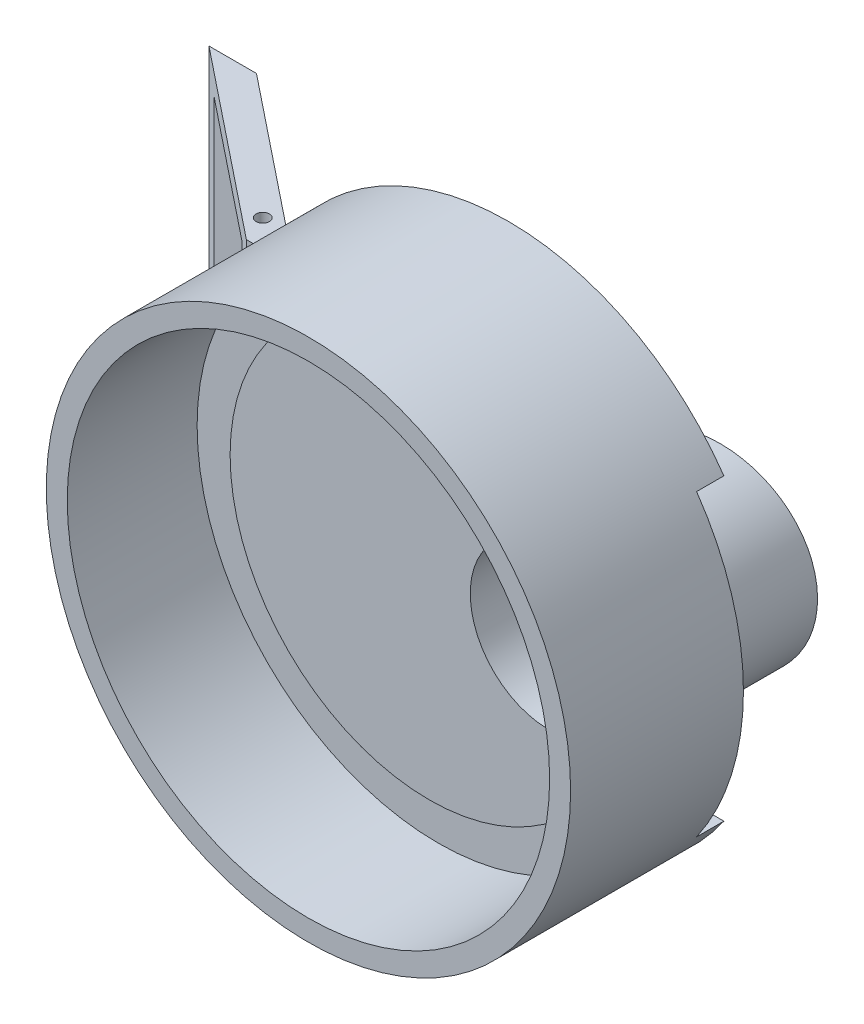
ISO-10303-21;
HEADER;
FILE_DESCRIPTION(('STEP AP214'),'2;1');
FILE_NAME('part.step','',(''),(''),'','','');
FILE_SCHEMA(('AUTOMOTIVE_DESIGN { 1 0 10303 214 1 1 1 1 }'));
ENDSEC;
DATA;
#1=APPLICATION_CONTEXT('core data for automotive mechanical design processes');
#2=APPLICATION_PROTOCOL_DEFINITION('international standard','automotive_design',2000,#1);
#3=PRODUCT_CONTEXT('',#1,'mechanical');
#4=PRODUCT('Part','Part','',(#3));
#5=PRODUCT_RELATED_PRODUCT_CATEGORY('part','',(#4));
#6=PRODUCT_DEFINITION_FORMATION('','',#4);
#7=PRODUCT_DEFINITION_CONTEXT('part definition',#1,'design');
#8=PRODUCT_DEFINITION('design','',#6,#7);
#9=PRODUCT_DEFINITION_SHAPE('','',#8);
#10=(LENGTH_UNIT() NAMED_UNIT(*) SI_UNIT(.MILLI.,.METRE.));
#11=(NAMED_UNIT(*) PLANE_ANGLE_UNIT() SI_UNIT($,.RADIAN.));
#12=(NAMED_UNIT(*) SI_UNIT($,.STERADIAN.) SOLID_ANGLE_UNIT());
#13=UNCERTAINTY_MEASURE_WITH_UNIT(LENGTH_MEASURE(1.E-05),#10,'distance_accuracy_value','');
#14=(GEOMETRIC_REPRESENTATION_CONTEXT(3) GLOBAL_UNCERTAINTY_ASSIGNED_CONTEXT((#13)) GLOBAL_UNIT_ASSIGNED_CONTEXT((#10,
#11,#12)) REPRESENTATION_CONTEXT('',''));
#15=CARTESIAN_POINT('',(0.,0.,0.));
#16=DIRECTION('',(0.,0.,1.));
#17=DIRECTION('',(1.,0.,0.));
#18=AXIS2_PLACEMENT_3D('',#15,#16,#17);
#19=CARTESIAN_POINT('',(0.,0.,-50.1023826602094));
#20=DIRECTION('',(0.,0.,-1.));
#21=DIRECTION('',(-1.,0.,0.));
#22=AXIS2_PLACEMENT_3D('',#19,#20,#21);
#23=PLANE('',#22);
#24=DIRECTION('',(1.,0.,0.));
#25=VECTOR('',#24,1.);
#26=CARTESIAN_POINT('',(0.,18.1080161915398,-50.1023826602094));
#27=LINE('',#26,#25);
#28=CARTESIAN_POINT('',(-26.0799204294594,18.1080161915398,-50.1023826602094));
#29=VERTEX_POINT('',#28);
#30=CARTESIAN_POINT('',(26.0799204294594,18.1080161915398,-50.1023826602094));
#31=VERTEX_POINT('',#30);
#32=EDGE_CURVE('E172',#29,#31,#27,.T.);
#33=ORIENTED_EDGE('',*,*,#32,.F.);
#34=CARTESIAN_POINT('',(0.,0.,-50.1023826602094));
#35=DIRECTION('',(0.,0.,1.));
#36=DIRECTION('',(1.,0.,0.));
#37=AXIS2_PLACEMENT_3D('',#34,#35,#36);
#38=CIRCLE('',#37,31.75);
#39=EDGE_CURVE('E58',#31,#29,#38,.T.);
#40=ORIENTED_EDGE('',*,*,#39,.F.);
#41=EDGE_LOOP('',(#33,#40));
#42=FACE_BOUND('',#41,.T.);
#43=ADVANCED_FACE('F47',(#42),#23,.T.);
#44=CARTESIAN_POINT('',(-26.0799204294594,-18.1080161915398,-50.1023826602094));
#45=VERTEX_POINT('',#44);
#46=CARTESIAN_POINT('',(26.0799204294594,-18.1080161915398,-50.1023826602094));
#47=VERTEX_POINT('',#46);
#48=EDGE_CURVE('E488',#45,#47,#38,.T.);
#49=ORIENTED_EDGE('',*,*,#48,.F.);
#50=DIRECTION('',(1.,0.,0.));
#51=VECTOR('',#50,1.);
#52=CARTESIAN_POINT('',(0.,-18.1080161915398,-50.1023826602094));
#53=LINE('',#52,#51);
#54=EDGE_CURVE('E215',#45,#47,#53,.T.);
#55=ORIENTED_EDGE('',*,*,#54,.T.);
#56=EDGE_LOOP('',(#49,#55));
#57=FACE_BOUND('',#56,.T.);
#58=ADVANCED_FACE('F376',(#57),#23,.T.);
#59=CARTESIAN_POINT('',(-25.9963160724515,13.97,-50.1023826602094));
#60=DIRECTION('',(-0.624333953493612,0.,0.781157547819284));
#61=DIRECTION('',(0.781157547819284,0.,0.624333953493612));
#62=AXIS2_PLACEMENT_3D('',#59,#60,#61);
#63=PLANE('',#62);
#64=DIRECTION('',(-0.781157547819284,0.,-0.624333953493612));
#65=VECTOR('',#64,1.);
#66=CARTESIAN_POINT('',(-25.9963160724515,-13.97,-50.1023826602094));
#67=LINE('',#66,#65);
#68=CARTESIAN_POINT('',(-25.9963160724515,-13.97,-50.1023826602094));
#69=VERTEX_POINT('',#68);
#70=CARTESIAN_POINT('',(-48.5659105228202,-13.97,-68.1409514115236));
#71=VERTEX_POINT('',#70);
#72=EDGE_CURVE('E455',#69,#71,#67,.T.);
#73=ORIENTED_EDGE('',*,*,#72,.T.);
#74=DIRECTION('',(0.,-1.,0.));
#75=VECTOR('',#74,1.);
#76=CARTESIAN_POINT('',(-48.5659105228202,13.97,-68.1409514115236));
#77=LINE('',#76,#75);
#78=CARTESIAN_POINT('',(-48.5659105228202,13.97,-68.1409514115236));
#79=VERTEX_POINT('',#78);
#80=EDGE_CURVE('E464',#79,#71,#77,.T.);
#81=ORIENTED_EDGE('',*,*,#80,.F.);
#82=DIRECTION('',(-0.781157547819284,0.,-0.624333953493612));
#83=VECTOR('',#82,1.);
#84=CARTESIAN_POINT('',(-25.9963160724515,13.97,-50.1023826602094));
#85=LINE('',#84,#83);
#86=CARTESIAN_POINT('',(-25.9963160724515,13.97,-50.1023826602094));
#87=VERTEX_POINT('',#86);
#88=EDGE_CURVE('E445',#87,#79,#85,.T.);
#89=ORIENTED_EDGE('',*,*,#88,.F.);
#90=DIRECTION('',(0.,-1.,0.));
#91=VECTOR('',#90,1.);
#92=CARTESIAN_POINT('',(-25.9963160724515,13.97,-50.1023826602094));
#93=LINE('',#92,#91);
#94=EDGE_CURVE('E467',#87,#69,#93,.T.);
#95=ORIENTED_EDGE('',*,*,#94,.T.);
#96=EDGE_LOOP('',(#73,#81,#89,#95));
#97=FACE_BOUND('',#96,.T.);
#98=DIRECTION('',(0.,1.,0.));
#99=VECTOR('',#98,1.);
#100=CARTESIAN_POINT('',(-45.5897002656287,10.795,-65.762239048713));
#101=LINE('',#100,#99);
#102=CARTESIAN_POINT('',(-45.5897002656287,-10.795,-65.762239048713));
#103=VERTEX_POINT('',#102);
#104=CARTESIAN_POINT('',(-45.5897002656287,10.795,-65.762239048713));
#105=VERTEX_POINT('',#104);
#106=EDGE_CURVE('E256',#103,#105,#101,.T.);
#107=ORIENTED_EDGE('',*,*,#106,.F.);
#108=DIRECTION('',(-0.781157547819283,0.,-0.624333953493612));
#109=VECTOR('',#108,1.);
#110=CARTESIAN_POINT('',(-28.7245088082104,-10.795,-52.2828689927859));
#111=LINE('',#110,#109);
#112=CARTESIAN_POINT('',(-28.7245088082104,-10.795,-52.2828689927859));
#113=VERTEX_POINT('',#112);
#114=EDGE_CURVE('E404',#113,#103,#111,.T.);
#115=ORIENTED_EDGE('',*,*,#114,.F.);
#116=DIRECTION('',(0.,-1.,0.));
#117=VECTOR('',#116,1.);
#118=CARTESIAN_POINT('',(-28.7245088082104,10.795,-52.2828689927859));
#119=LINE('',#118,#117);
#120=CARTESIAN_POINT('',(-28.7245088082104,10.795,-52.2828689927859));
#121=VERTEX_POINT('',#120);
#122=EDGE_CURVE('E227',#121,#113,#119,.T.);
#123=ORIENTED_EDGE('',*,*,#122,.F.);
#124=DIRECTION('',(0.781157547819283,0.,0.624333953493612));
#125=VECTOR('',#124,1.);
#126=CARTESIAN_POINT('',(-28.7245088082104,10.795,-52.2828689927859));
#127=LINE('',#126,#125);
#128=EDGE_CURVE('E409',#105,#121,#127,.T.);
#129=ORIENTED_EDGE('',*,*,#128,.F.);
#130=EDGE_LOOP('',(#107,#115,#123,#129));
#131=FACE_BOUND('',#130,.T.);
#132=ADVANCED_FACE('F349',(#97,#131),#63,.F.);
#133=CARTESIAN_POINT('',(-31.75,13.97,-50.1023826602094));
#134=DIRECTION('',(0.624333953493612,0.,-0.781157547819284));
#135=DIRECTION('',(-0.781157547819284,0.,-0.624333953493612));
#136=AXIS2_PLACEMENT_3D('',#133,#134,#135);
#137=PLANE('',#136);
#138=DIRECTION('',(0.781157547819284,0.,0.624333953493612));
#139=VECTOR('',#138,1.);
#140=CARTESIAN_POINT('',(-31.75,-13.97,-50.1023826602094));
#141=LINE('',#140,#139);
#142=CARTESIAN_POINT('',(-54.3195944503687,-13.97,-68.1409514115236));
#143=VERTEX_POINT('',#142);
#144=CARTESIAN_POINT('',(-31.75,-13.97,-50.1023826602094));
#145=VERTEX_POINT('',#144);
#146=EDGE_CURVE('E446',#143,#145,#141,.T.);
#147=ORIENTED_EDGE('',*,*,#146,.T.);
#148=DIRECTION('',(0.,-1.,0.));
#149=VECTOR('',#148,1.);
#150=CARTESIAN_POINT('',(-31.75,13.97,-50.1023826602094));
#151=LINE('',#150,#149);
#152=CARTESIAN_POINT('',(-31.75,0.,-50.1023826602094));
#153=VERTEX_POINT('',#152);
#154=EDGE_CURVE('E462',#153,#145,#151,.T.);
#155=ORIENTED_EDGE('',*,*,#154,.F.);
#156=CARTESIAN_POINT('',(-31.75,13.97,-50.1023826602094));
#157=VERTEX_POINT('',#156);
#158=EDGE_CURVE('E459',#157,#153,#151,.T.);
#159=ORIENTED_EDGE('',*,*,#158,.F.);
#160=DIRECTION('',(0.781157547819285,0.,0.62433395349361));
#161=VECTOR('',#160,1.);
#162=CARTESIAN_POINT('',(-52.8910135269167,13.97,-66.9991694773745));
#163=LINE('',#162,#161);
#164=CARTESIAN_POINT('',(-54.3195944503687,13.97,-68.1409514115236));
#165=VERTEX_POINT('',#164);
#166=EDGE_CURVE('E441',#165,#157,#163,.T.);
#167=ORIENTED_EDGE('',*,*,#166,.F.);
#168=DIRECTION('',(0.,-1.,0.));
#169=VECTOR('',#168,1.);
#170=CARTESIAN_POINT('',(-54.3195944503687,13.97,-68.1409514115236));
#171=LINE('',#170,#169);
#172=EDGE_CURVE('E461',#165,#143,#171,.T.);
#173=ORIENTED_EDGE('',*,*,#172,.T.);
#174=EDGE_LOOP('',(#147,#155,#159,#167,#173));
#175=FACE_BOUND('',#174,.T.);
#176=DIRECTION('',(0.,-1.,0.));
#177=VECTOR('',#176,1.);
#178=CARTESIAN_POINT('',(-51.3433841931772,11.43,-65.762239048713));
#179=LINE('',#178,#177);
#180=CARTESIAN_POINT('',(-51.3433841931772,11.43,-65.762239048713));
#181=VERTEX_POINT('',#180);
#182=CARTESIAN_POINT('',(-51.3433841931772,-10.16,-65.762239048713));
#183=VERTEX_POINT('',#182);
#184=EDGE_CURVE('E249',#181,#183,#179,.T.);
#185=ORIENTED_EDGE('',*,*,#184,.F.);
#186=DIRECTION('',(-0.781157547819284,0.,-0.624333953493612));
#187=VECTOR('',#186,1.);
#188=CARTESIAN_POINT('',(-51.3433841931772,11.43,-65.762239048713));
#189=LINE('',#188,#187);
#190=CARTESIAN_POINT('',(-34.4781927357589,11.43,-52.2828689927859));
#191=VERTEX_POINT('',#190);
#192=EDGE_CURVE('E332',#191,#181,#189,.T.);
#193=ORIENTED_EDGE('',*,*,#192,.F.);
#194=DIRECTION('',(0.,1.,0.));
#195=VECTOR('',#194,1.);
#196=CARTESIAN_POINT('',(-34.4781927357589,11.43,-52.2828689927859));
#197=LINE('',#196,#195);
#198=CARTESIAN_POINT('',(-34.4781927357589,-10.16,-52.2828689927859));
#199=VERTEX_POINT('',#198);
#200=EDGE_CURVE('E292',#199,#191,#197,.T.);
#201=ORIENTED_EDGE('',*,*,#200,.F.);
#202=DIRECTION('',(0.781157547819284,0.,0.624333953493612));
#203=VECTOR('',#202,1.);
#204=CARTESIAN_POINT('',(-51.3433841931772,-10.16,-65.762239048713));
#205=LINE('',#204,#203);
#206=EDGE_CURVE('E73',#183,#199,#205,.T.);
#207=ORIENTED_EDGE('',*,*,#206,.F.);
#208=EDGE_LOOP('',(#185,#193,#201,#207));
#209=FACE_BOUND('',#208,.T.);
#210=ADVANCED_FACE('F331',(#175,#209),#137,.F.);
#211=DIRECTION('',(-1.,0.,0.));
#212=VECTOR('',#211,1.);
#213=CARTESIAN_POINT('',(0.,13.9699999999999,-50.1023826602094));
#214=LINE('',#213,#212);
#215=CARTESIAN_POINT('',(-5.01861852067778,13.9699999999999,-50.1023826602094));
#216=VERTEX_POINT('',#215);
#217=EDGE_CURVE('E191',#216,#87,#214,.T.);
#218=ORIENTED_EDGE('',*,*,#217,.F.);
#219=DIRECTION('',(0.,-1.,0.));
#220=VECTOR('',#219,1.);
#221=CARTESIAN_POINT('',(-5.01861852067778,0.,-50.1023826602094));
#222=LINE('',#221,#220);
#223=CARTESIAN_POINT('',(-5.01861852067778,-13.97,-50.1023826602094));
#224=VERTEX_POINT('',#223);
#225=EDGE_CURVE('E221',#216,#224,#222,.T.);
#226=ORIENTED_EDGE('',*,*,#225,.T.);
#227=DIRECTION('',(1.,0.,0.));
#228=VECTOR('',#227,1.);
#229=CARTESIAN_POINT('',(0.,-13.97,-50.1023826602094));
#230=LINE('',#229,#228);
#231=EDGE_CURVE('E219',#69,#224,#230,.T.);
#232=ORIENTED_EDGE('',*,*,#231,.F.);
#233=ORIENTED_EDGE('',*,*,#94,.F.);
#234=EDGE_LOOP('',(#218,#226,#232,#233));
#235=FACE_BOUND('',#234,.T.);
#236=ADVANCED_FACE('F49',(#235),#23,.T.);
#237=CARTESIAN_POINT('',(0.,0.,0.));
#238=DIRECTION('',(0.,0.,1.));
#239=DIRECTION('',(1.,0.,0.));
#240=AXIS2_PLACEMENT_3D('',#237,#238,#239);
#241=CYLINDRICAL_SURFACE('',#240,31.75);
#242=DIRECTION('',(0.,0.,-1.));
#243=VECTOR('',#242,1.);
#244=CARTESIAN_POINT('',(-28.5114292872174,-13.97,-46.8003826602094));
#245=LINE('',#244,#243);
#246=CARTESIAN_POINT('',(-28.5114292872174,-13.97,-46.8003826602094));
#247=VERTEX_POINT('',#246);
#248=CARTESIAN_POINT('',(-28.5114292872174,-13.97,-50.1023826602094));
#249=VERTEX_POINT('',#248);
#250=EDGE_CURVE('E235',#247,#249,#245,.T.);
#251=ORIENTED_EDGE('',*,*,#250,.F.);
#252=CARTESIAN_POINT('',(0.,0.,-46.8003826602094));
#253=DIRECTION('',(0.,0.,-1.));
#254=DIRECTION('',(-1.,0.,0.));
#255=AXIS2_PLACEMENT_3D('',#252,#253,#254);
#256=CIRCLE('',#255,31.75);
#257=CARTESIAN_POINT('',(-26.0799204294594,-18.1080161915398,-46.8003826602094));
#258=VERTEX_POINT('',#257);
#259=EDGE_CURVE('E199',#258,#247,#256,.T.);
#260=ORIENTED_EDGE('',*,*,#259,.F.);
#261=DIRECTION('',(0.,0.,-1.));
#262=VECTOR('',#261,1.);
#263=CARTESIAN_POINT('',(-26.0799204294594,-18.1080161915398,-46.8003826602094));
#264=LINE('',#263,#262);
#265=EDGE_CURVE('E237',#258,#45,#264,.T.);
#266=ORIENTED_EDGE('',*,*,#265,.T.);
#267=ORIENTED_EDGE('',*,*,#48,.T.);
#268=DIRECTION('',(0.,0.,-1.));
#269=VECTOR('',#268,1.);
#270=CARTESIAN_POINT('',(26.0799204294594,-18.1080161915398,-46.8003826602094));
#271=LINE('',#270,#269);
#272=CARTESIAN_POINT('',(26.0799204294594,-18.1080161915398,-46.8003826602094));
#273=VERTEX_POINT('',#272);
#274=EDGE_CURVE('E177',#273,#47,#271,.T.);
#275=ORIENTED_EDGE('',*,*,#274,.F.);
#276=CARTESIAN_POINT('',(26.0799204294594,18.1080161915398,-46.8003826602094));
#277=VERTEX_POINT('',#276);
#278=EDGE_CURVE('E185',#277,#273,#256,.T.);
#279=ORIENTED_EDGE('',*,*,#278,.F.);
#280=DIRECTION('',(0.,0.,-1.));
#281=VECTOR('',#280,1.);
#282=CARTESIAN_POINT('',(26.0799204294594,18.1080161915398,-46.8003826602094));
#283=LINE('',#282,#281);
#284=EDGE_CURVE('E166',#277,#31,#283,.T.);
#285=ORIENTED_EDGE('',*,*,#284,.T.);
#286=ORIENTED_EDGE('',*,*,#39,.T.);
#287=DIRECTION('',(0.,0.,-1.));
#288=VECTOR('',#287,1.);
#289=CARTESIAN_POINT('',(-26.0799204294594,18.1080161915398,-46.8003826602094));
#290=LINE('',#289,#288);
#291=CARTESIAN_POINT('',(-26.0799204294594,18.1080161915398,-46.8003826602094));
#292=VERTEX_POINT('',#291);
#293=EDGE_CURVE('E225',#292,#29,#290,.T.);
#294=ORIENTED_EDGE('',*,*,#293,.F.);
#295=CARTESIAN_POINT('',(-28.5114292872174,13.97,-46.8003826602094));
#296=VERTEX_POINT('',#295);
#297=EDGE_CURVE('E189',#296,#292,#256,.T.);
#298=ORIENTED_EDGE('',*,*,#297,.F.);
#299=DIRECTION('',(0.,0.,-1.));
#300=VECTOR('',#299,1.);
#301=CARTESIAN_POINT('',(-28.5114292872174,13.97,-46.8003826602094));
#302=LINE('',#301,#300);
#303=CARTESIAN_POINT('',(-28.5114292872174,13.97,-50.1023826602094));
#304=VERTEX_POINT('',#303);
#305=EDGE_CURVE('E228',#296,#304,#302,.T.);
#306=ORIENTED_EDGE('',*,*,#305,.T.);
#307=EDGE_CURVE('E12',#304,#153,#38,.T.);
#308=ORIENTED_EDGE('',*,*,#307,.T.);
#309=EDGE_CURVE('E56',#153,#249,#38,.T.);
#310=ORIENTED_EDGE('',*,*,#309,.T.);
#311=EDGE_LOOP('',(#251,#260,#266,#267,#275,#279,#285,#286,#294,#298,#306,#308,#310));
#312=FACE_BOUND('',#311,.T.);
#313=CARTESIAN_POINT('',(0.,0.,-25.8707826602094));
#314=DIRECTION('',(0.,0.,1.));
#315=DIRECTION('',(1.,0.,0.));
#316=AXIS2_PLACEMENT_3D('',#313,#314,#315);
#317=CIRCLE('',#316,31.75);
#318=CARTESIAN_POINT('',(31.75,0.,-25.8707826602094));
#319=VERTEX_POINT('',#318);
#320=EDGE_CURVE('E484',#319,#319,#317,.T.);
#321=ORIENTED_EDGE('',*,*,#320,.F.);
#322=EDGE_LOOP('',(#321));
#323=FACE_BOUND('',#322,.T.);
#324=ADVANCED_FACE('F194',(#312,#323),#241,.T.);
#325=CARTESIAN_POINT('',(31.75,0.,-25.8707826602094));
#326=DIRECTION('',(0.,0.,1.));
#327=DIRECTION('',(1.,0.,0.));
#328=AXIS2_PLACEMENT_3D('',#325,#326,#327);
#329=PLANE('',#328);
#330=ORIENTED_EDGE('',*,*,#320,.T.);
#331=EDGE_LOOP('',(#330));
#332=FACE_BOUND('',#331,.T.);
#333=CARTESIAN_POINT('',(0.,0.,-25.8707826602094));
#334=DIRECTION('',(0.,0.,1.));
#335=DIRECTION('',(1.,0.,0.));
#336=AXIS2_PLACEMENT_3D('',#333,#334,#335);
#337=CIRCLE('',#336,29.21);
#338=CARTESIAN_POINT('',(29.21,0.,-25.8707826602094));
#339=VERTEX_POINT('',#338);
#340=EDGE_CURVE('E482',#339,#339,#337,.T.);
#341=ORIENTED_EDGE('',*,*,#340,.F.);
#342=EDGE_LOOP('',(#341));
#343=FACE_BOUND('',#342,.T.);
#344=ADVANCED_FACE('F523',(#332,#343),#329,.T.);
#345=CARTESIAN_POINT('',(0.,0.,0.));
#346=DIRECTION('',(0.,0.,1.));
#347=DIRECTION('',(1.,0.,0.));
#348=AXIS2_PLACEMENT_3D('',#345,#346,#347);
#349=CYLINDRICAL_SURFACE('',#348,29.21);
#350=ORIENTED_EDGE('',*,*,#340,.T.);
#351=EDGE_LOOP('',(#350));
#352=FACE_BOUND('',#351,.T.);
#353=CARTESIAN_POINT('',(0.,0.,-41.5978991912802));
#354=DIRECTION('',(0.,0.,1.));
#355=DIRECTION('',(1.,0.,0.));
#356=AXIS2_PLACEMENT_3D('',#353,#354,#355);
#357=CIRCLE('',#356,29.21);
#358=CARTESIAN_POINT('',(29.21,0.,-41.5978991912802));
#359=VERTEX_POINT('',#358);
#360=EDGE_CURVE('E479',#359,#359,#357,.T.);
#361=ORIENTED_EDGE('',*,*,#360,.F.);
#362=EDGE_LOOP('',(#361));
#363=FACE_BOUND('',#362,.T.);
#364=ADVANCED_FACE('F737',(#352,#363),#349,.F.);
#365=CARTESIAN_POINT('',(29.21,0.,-41.5978991912802));
#366=DIRECTION('',(0.,0.,1.));
#367=DIRECTION('',(1.,0.,0.));
#368=AXIS2_PLACEMENT_3D('',#365,#366,#367);
#369=PLANE('',#368);
#370=ORIENTED_EDGE('',*,*,#360,.T.);
#371=EDGE_LOOP('',(#370));
#372=FACE_BOUND('',#371,.T.);
#373=CARTESIAN_POINT('',(0.,0.,-41.5978991912802));
#374=DIRECTION('',(0.,0.,1.));
#375=DIRECTION('',(1.,0.,0.));
#376=AXIS2_PLACEMENT_3D('',#373,#374,#375);
#377=CIRCLE('',#376,24.13);
#378=CARTESIAN_POINT('',(24.13,0.,-41.5978991912802));
#379=VERTEX_POINT('',#378);
#380=EDGE_CURVE('E476',#379,#379,#377,.T.);
#381=ORIENTED_EDGE('',*,*,#380,.F.);
#382=EDGE_LOOP('',(#381));
#383=FACE_BOUND('',#382,.T.);
#384=ADVANCED_FACE('F727',(#372,#383),#369,.T.);
#385=CARTESIAN_POINT('',(0.,0.,0.));
#386=DIRECTION('',(0.,0.,1.));
#387=DIRECTION('',(1.,0.,0.));
#388=AXIS2_PLACEMENT_3D('',#385,#386,#387);
#389=CYLINDRICAL_SURFACE('',#388,24.13);
#390=ORIENTED_EDGE('',*,*,#380,.T.);
#391=EDGE_LOOP('',(#390));
#392=FACE_BOUND('',#391,.T.);
#393=CARTESIAN_POINT('',(0.,0.,-40.5138826602094));
#394=DIRECTION('',(0.,0.,1.));
#395=DIRECTION('',(1.,0.,0.));
#396=AXIS2_PLACEMENT_3D('',#393,#394,#395);
#397=CIRCLE('',#396,24.13);
#398=CARTESIAN_POINT('',(24.13,0.,-40.5138826602094));
#399=VERTEX_POINT('',#398);
#400=EDGE_CURVE('E473',#399,#399,#397,.T.);
#401=ORIENTED_EDGE('',*,*,#400,.F.);
#402=EDGE_LOOP('',(#401));
#403=FACE_BOUND('',#402,.T.);
#404=ADVANCED_FACE('F717',(#392,#403),#389,.T.);
#405=CARTESIAN_POINT('',(24.13,0.,-40.5138826602094));
#406=DIRECTION('',(0.,0.,1.));
#407=DIRECTION('',(1.,0.,0.));
#408=AXIS2_PLACEMENT_3D('',#405,#406,#407);
#409=PLANE('',#408);
#410=CARTESIAN_POINT('',(14.478,0.,-40.5138826602094));
#411=DIRECTION('',(0.,0.,1.));
#412=DIRECTION('',(1.,0.,0.));
#413=AXIS2_PLACEMENT_3D('',#410,#411,#412);
#414=CIRCLE('',#413,9.52500000000001);
#415=CARTESIAN_POINT('',(24.003,0.,-40.5138826602094));
#416=VERTEX_POINT('',#415);
#417=EDGE_CURVE('E470',#416,#416,#414,.T.);
#418=ORIENTED_EDGE('',*,*,#417,.F.);
#419=EDGE_LOOP('',(#418));
#420=FACE_BOUND('',#419,.T.);
#421=ORIENTED_EDGE('',*,*,#400,.T.);
#422=EDGE_LOOP('',(#421));
#423=FACE_BOUND('',#422,.T.);
#424=ADVANCED_FACE('F616',(#420,#423),#409,.T.);
#425=CARTESIAN_POINT('',(14.478,0.,-91.3138826602094));
#426=DIRECTION('',(0.,0.,1.));
#427=DIRECTION('',(1.,0.,0.));
#428=AXIS2_PLACEMENT_3D('',#425,#426,#427);
#429=CYLINDRICAL_SURFACE('',#428,9.52500000000001);
#430=CARTESIAN_POINT('',(14.478,0.,-59.1708696006639));
#431=DIRECTION('',(0.148509647000191,0.,0.988910958958327));
#432=DIRECTION('',(-0.988910958958327,0.,0.148509647000191));
#433=AXIS2_PLACEMENT_3D('',#430,#431,#432);
#434=ELLIPSE('',#433,9.63180750877025,9.52500000000001);
#435=CARTESIAN_POINT('',(4.95299999999999,0.,-57.7404532675627));
#436=VERTEX_POINT('',#435);
#437=EDGE_CURVE('E216',#436,#436,#434,.F.);
#438=ORIENTED_EDGE('',*,*,#437,.T.);
#439=EDGE_LOOP('',(#438));
#440=FACE_BOUND('',#439,.T.);
#441=ORIENTED_EDGE('',*,*,#417,.T.);
#442=EDGE_LOOP('',(#441));
#443=FACE_BOUND('',#442,.T.);
#444=ADVANCED_FACE('F611',(#440,#443),#429,.F.);
#445=CARTESIAN_POINT('',(14.478,0.,-64.0723826602094));
#446=DIRECTION('',(0.,0.,1.));
#447=DIRECTION('',(1.,0.,0.));
#448=AXIS2_PLACEMENT_3D('',#445,#446,#447);
#449=CYLINDRICAL_SURFACE('',#448,12.065);
#450=CARTESIAN_POINT('',(14.478,0.,-59.1708696006639));
#451=DIRECTION('',(0.148509647000191,0.,0.988910958958327));
#452=DIRECTION('',(-0.988910958958327,0.,0.148509647000191));
#453=AXIS2_PLACEMENT_3D('',#450,#451,#452);
#454=ELLIPSE('',#453,12.200289511109,12.065);
#455=CARTESIAN_POINT('',(2.41299999999999,0.,-57.359008912069));
#456=VERTEX_POINT('',#455);
#457=EDGE_CURVE('E413',#456,#456,#454,.T.);
#458=ORIENTED_EDGE('',*,*,#457,.T.);
#459=EDGE_LOOP('',(#458));
#460=FACE_BOUND('',#459,.T.);
#461=CARTESIAN_POINT('',(14.478,0.,-46.8003826602094));
#462=DIRECTION('',(0.,0.,-1.));
#463=DIRECTION('',(-1.,0.,0.));
#464=AXIS2_PLACEMENT_3D('',#461,#462,#463);
#465=CIRCLE('',#464,12.065);
#466=CARTESIAN_POINT('',(2.41299999999999,0.,-46.8003826602094));
#467=VERTEX_POINT('',#466);
#468=EDGE_CURVE('E178',#467,#467,#465,.F.);
#469=ORIENTED_EDGE('',*,*,#468,.F.);
#470=EDGE_LOOP('',(#469));
#471=FACE_BOUND('',#470,.T.);
#472=ADVANCED_FACE('F511',(#460,#471),#449,.T.);
#473=CARTESIAN_POINT('',(-25.9963160724515,13.97,-50.1023826602094));
#474=DIRECTION('',(0.,0.,-1.));
#475=DIRECTION('',(-1.,0.,0.));
#476=AXIS2_PLACEMENT_3D('',#473,#474,#475);
#477=PLANE('',#476);
#478=ORIENTED_EDGE('',*,*,#309,.F.);
#479=ORIENTED_EDGE('',*,*,#154,.T.);
#480=DIRECTION('',(1.,0.,0.));
#481=VECTOR('',#480,1.);
#482=CARTESIAN_POINT('',(-25.9963160724515,-13.97,-50.1023826602094));
#483=LINE('',#482,#481);
#484=EDGE_CURVE('E495',#145,#249,#483,.T.);
#485=ORIENTED_EDGE('',*,*,#484,.T.);
#486=EDGE_LOOP('',(#478,#479,#485));
#487=FACE_BOUND('',#486,.T.);
#488=ADVANCED_FACE('F494',(#487),#477,.F.);
#489=ORIENTED_EDGE('',*,*,#307,.F.);
#490=DIRECTION('',(1.,0.,0.));
#491=VECTOR('',#490,1.);
#492=CARTESIAN_POINT('',(-25.9963160724515,13.97,-50.1023826602094));
#493=LINE('',#492,#491);
#494=EDGE_CURVE('E399',#157,#304,#493,.T.);
#495=ORIENTED_EDGE('',*,*,#494,.F.);
#496=ORIENTED_EDGE('',*,*,#158,.T.);
#497=EDGE_LOOP('',(#489,#495,#496));
#498=FACE_BOUND('',#497,.T.);
#499=ADVANCED_FACE('F378',(#498),#477,.F.);
#500=CARTESIAN_POINT('',(-48.5659105228202,13.97,-68.1409514115236));
#501=DIRECTION('',(0.,0.,1.));
#502=DIRECTION('',(1.,0.,0.));
#503=AXIS2_PLACEMENT_3D('',#500,#501,#502);
#504=PLANE('',#503);
#505=DIRECTION('',(-1.,0.,0.));
#506=VECTOR('',#505,1.);
#507=CARTESIAN_POINT('',(-48.5659105228202,-13.97,-68.1409514115236));
#508=LINE('',#507,#506);
#509=EDGE_CURVE('E449',#71,#143,#508,.T.);
#510=ORIENTED_EDGE('',*,*,#509,.T.);
#511=ORIENTED_EDGE('',*,*,#172,.F.);
#512=DIRECTION('',(-1.,0.,0.));
#513=VECTOR('',#512,1.);
#514=CARTESIAN_POINT('',(-48.5659105228202,13.97,-68.1409514115236));
#515=LINE('',#514,#513);
#516=EDGE_CURVE('E447',#79,#165,#515,.T.);
#517=ORIENTED_EDGE('',*,*,#516,.F.);
#518=ORIENTED_EDGE('',*,*,#80,.T.);
#519=EDGE_LOOP('',(#510,#511,#517,#518));
#520=FACE_BOUND('',#519,.T.);
#521=ADVANCED_FACE('F351',(#520),#504,.F.);
#522=CARTESIAN_POINT('',(0.,13.97,0.));
#523=DIRECTION('',(0.,-1.,0.));
#524=DIRECTION('',(0.,0.,-1.));
#525=AXIS2_PLACEMENT_3D('',#522,#523,#524);
#526=PLANE('',#525);
#527=CARTESIAN_POINT('',(-33.050089724575,13.97,-53.3872413135533));
#528=DIRECTION('',(0.,1.,0.));
#529=DIRECTION('',(0.,0.,1.));
#530=AXIS2_PLACEMENT_3D('',#527,#528,#529);
#531=CIRCLE('',#530,0.811013260745042);
#532=CARTESIAN_POINT('',(-33.050089724575,13.97,-52.5762280528082));
#533=VERTEX_POINT('',#532);
#534=EDGE_CURVE('E429',#533,#533,#531,.T.);
#535=ORIENTED_EDGE('',*,*,#534,.F.);
#536=EDGE_LOOP('',(#535));
#537=FACE_BOUND('',#536,.T.);
#538=ORIENTED_EDGE('',*,*,#494,.T.);
#539=ORIENTED_EDGE('',*,*,#305,.F.);
#540=DIRECTION('',(-1.,0.,0.));
#541=VECTOR('',#540,1.);
#542=CARTESIAN_POINT('',(0.,13.9699999999999,-46.8003826602094));
#543=LINE('',#542,#541);
#544=CARTESIAN_POINT('',(-5.01861852067778,13.9699999999999,-46.8003826602094));
#545=VERTEX_POINT('',#544);
#546=EDGE_CURVE('E201',#545,#296,#543,.T.);
#547=ORIENTED_EDGE('',*,*,#546,.F.);
#548=DIRECTION('',(0.,0.,-1.));
#549=VECTOR('',#548,1.);
#550=CARTESIAN_POINT('',(-5.01861852067778,13.9699999999999,-46.8003826602094));
#551=LINE('',#550,#549);
#552=EDGE_CURVE('E230',#545,#216,#551,.T.);
#553=ORIENTED_EDGE('',*,*,#552,.T.);
#554=ORIENTED_EDGE('',*,*,#217,.T.);
#555=ORIENTED_EDGE('',*,*,#88,.T.);
#556=ORIENTED_EDGE('',*,*,#516,.T.);
#557=ORIENTED_EDGE('',*,*,#166,.T.);
#558=EDGE_LOOP('',(#538,#539,#547,#553,#554,#555,#556,#557));
#559=FACE_BOUND('',#558,.T.);
#560=ADVANCED_FACE('F310',(#537,#559),#526,.F.);
#561=CARTESIAN_POINT('',(0.,-13.97,0.));
#562=DIRECTION('',(0.,-1.,0.));
#563=DIRECTION('',(0.,0.,-1.));
#564=AXIS2_PLACEMENT_3D('',#561,#562,#563);
#565=PLANE('',#564);
#566=CARTESIAN_POINT('',(-33.050089724575,-13.97,-53.3872413135533));
#567=DIRECTION('',(0.,-1.,0.));
#568=DIRECTION('',(0.,0.,-1.));
#569=AXIS2_PLACEMENT_3D('',#566,#567,#568);
#570=CIRCLE('',#569,0.811013260745042);
#571=CARTESIAN_POINT('',(-33.050089724575,-13.97,-54.1982545742983));
#572=VERTEX_POINT('',#571);
#573=EDGE_CURVE('E425',#572,#572,#570,.F.);
#574=ORIENTED_EDGE('',*,*,#573,.T.);
#575=EDGE_LOOP('',(#574));
#576=FACE_BOUND('',#575,.T.);
#577=ORIENTED_EDGE('',*,*,#484,.F.);
#578=ORIENTED_EDGE('',*,*,#146,.F.);
#579=ORIENTED_EDGE('',*,*,#509,.F.);
#580=ORIENTED_EDGE('',*,*,#72,.F.);
#581=ORIENTED_EDGE('',*,*,#231,.T.);
#582=DIRECTION('',(0.,0.,-1.));
#583=VECTOR('',#582,1.);
#584=CARTESIAN_POINT('',(-5.01861852067778,-13.97,-46.8003826602094));
#585=LINE('',#584,#583);
#586=CARTESIAN_POINT('',(-5.01861852067778,-13.97,-46.8003826602094));
#587=VERTEX_POINT('',#586);
#588=EDGE_CURVE('E232',#587,#224,#585,.T.);
#589=ORIENTED_EDGE('',*,*,#588,.F.);
#590=DIRECTION('',(1.,0.,0.));
#591=VECTOR('',#590,1.);
#592=CARTESIAN_POINT('',(0.,-13.97,-46.8003826602094));
#593=LINE('',#592,#591);
#594=EDGE_CURVE('E203',#247,#587,#593,.T.);
#595=ORIENTED_EDGE('',*,*,#594,.F.);
#596=ORIENTED_EDGE('',*,*,#250,.T.);
#597=EDGE_LOOP('',(#577,#578,#579,#580,#581,#589,#595,#596));
#598=FACE_BOUND('',#597,.T.);
#599=ADVANCED_FACE('F274',(#576,#598),#565,.T.);
#600=CARTESIAN_POINT('',(0.,0.,-65.762239048713));
#601=DIRECTION('',(0.,0.,1.));
#602=DIRECTION('',(1.,0.,0.));
#603=AXIS2_PLACEMENT_3D('',#600,#601,#602);
#604=PLANE('',#603);
#605=DIRECTION('',(-0.993964961056933,0.10969802273099,0.));
#606=VECTOR('',#605,1.);
#607=CARTESIAN_POINT('',(-45.5897002656287,-10.795,-65.762239048713));
#608=LINE('',#607,#606);
#609=EDGE_CURVE('E245',#103,#183,#608,.T.);
#610=ORIENTED_EDGE('',*,*,#609,.F.);
#611=ORIENTED_EDGE('',*,*,#106,.T.);
#612=DIRECTION('',(-0.993964961056933,0.10969802273099,0.));
#613=VECTOR('',#612,1.);
#614=CARTESIAN_POINT('',(-45.5897002656287,10.795,-65.762239048713));
#615=LINE('',#614,#613);
#616=EDGE_CURVE('E241',#105,#181,#615,.T.);
#617=ORIENTED_EDGE('',*,*,#616,.T.);
#618=ORIENTED_EDGE('',*,*,#184,.T.);
#619=EDGE_LOOP('',(#610,#611,#617,#618));
#620=FACE_BOUND('',#619,.T.);
#621=ADVANCED_FACE('F263',(#620),#604,.T.);
#622=CARTESIAN_POINT('',(1.58864376978103,14.3945734248649,-1.98768794267287));
#623=DIRECTION('',(-0.108679135549643,-0.984732906254878,0.135977751249992));
#624=DIRECTION('',(0.,-0.136787962619519,-0.990600349930486));
#625=AXIS2_PLACEMENT_3D('',#622,#623,#624);
#626=PLANE('',#625);
#627=CARTESIAN_POINT('',(-33.050089724575,11.1198904631781,-53.3872413135533));
#628=DIRECTION('',(-0.108679135549643,-0.984732906254878,0.135977751249992));
#629=DIRECTION('',(-0.614802188497362,0.174072121084401,0.769231542307017));
#630=AXIS2_PLACEMENT_3D('',#627,#628,#629);
#631=ELLIPSE('',#630,0.823587041312021,0.811013260745042);
#632=CARTESIAN_POINT('',(-33.5564328399917,11.2632540063569,-52.7537121835407));
#633=VERTEX_POINT('',#632);
#634=EDGE_CURVE('E415',#633,#633,#631,.T.);
#635=ORIENTED_EDGE('',*,*,#634,.F.);
#636=EDGE_LOOP('',(#635));
#637=FACE_BOUND('',#636,.T.);
#638=ORIENTED_EDGE('',*,*,#616,.F.);
#639=ORIENTED_EDGE('',*,*,#128,.T.);
#640=DIRECTION('',(-0.993964961056933,0.10969802273099,0.));
#641=VECTOR('',#640,1.);
#642=CARTESIAN_POINT('',(-28.7245088082104,10.795,-52.2828689927859));
#643=LINE('',#642,#641);
#644=EDGE_CURVE('E65',#121,#191,#643,.T.);
#645=ORIENTED_EDGE('',*,*,#644,.T.);
#646=ORIENTED_EDGE('',*,*,#192,.T.);
#647=EDGE_LOOP('',(#638,#639,#645,#646));
#648=FACE_BOUND('',#647,.T.);
#649=ADVANCED_FACE('F273',(#637,#648),#626,.T.);
#650=CARTESIAN_POINT('',(-0.721916324588836,-6.54122575404989,0.903251189032595));
#651=DIRECTION('',(0.108679135549643,0.984732906254877,-0.135977751249993));
#652=DIRECTION('',(0.,0.13678796261952,0.990600349930486));
#653=AXIS2_PLACEMENT_3D('',#650,#651,#652);
#654=PLANE('',#653);
#655=CARTESIAN_POINT('',(-33.050089724575,-10.4701095368219,-53.3872413135533));
#656=DIRECTION('',(0.108679135549643,0.984732906254877,-0.135977751249993));
#657=DIRECTION('',(-0.614802188497362,0.174072121084402,0.769231542307017));
#658=AXIS2_PLACEMENT_3D('',#655,#656,#657);
#659=ELLIPSE('',#658,0.823587041312021,0.811013260745042);
#660=CARTESIAN_POINT('',(-33.5564328399917,-10.3267459936431,-52.7537121835407));
#661=VERTEX_POINT('',#660);
#662=EDGE_CURVE('E51',#661,#661,#659,.T.);
#663=ORIENTED_EDGE('',*,*,#662,.F.);
#664=EDGE_LOOP('',(#663));
#665=FACE_BOUND('',#664,.T.);
#666=DIRECTION('',(-0.993964961056933,0.10969802273099,0.));
#667=VECTOR('',#666,1.);
#668=CARTESIAN_POINT('',(-28.7245088082104,-10.795,-52.2828689927859));
#669=LINE('',#668,#667);
#670=EDGE_CURVE('E244',#113,#199,#669,.T.);
#671=ORIENTED_EDGE('',*,*,#670,.F.);
#672=ORIENTED_EDGE('',*,*,#114,.T.);
#673=ORIENTED_EDGE('',*,*,#609,.T.);
#674=ORIENTED_EDGE('',*,*,#206,.T.);
#675=EDGE_LOOP('',(#671,#672,#673,#674));
#676=FACE_BOUND('',#675,.T.);
#677=ADVANCED_FACE('F309',(#665,#676),#654,.T.);
#678=CARTESIAN_POINT('',(1.26105391085463E-13,0.,-52.2828689927858));
#679=DIRECTION('',(0.,0.,-1.));
#680=DIRECTION('',(-1.,0.,0.));
#681=AXIS2_PLACEMENT_3D('',#678,#679,#680);
#682=PLANE('',#681);
#683=ORIENTED_EDGE('',*,*,#644,.F.);
#684=ORIENTED_EDGE('',*,*,#122,.T.);
#685=ORIENTED_EDGE('',*,*,#670,.T.);
#686=ORIENTED_EDGE('',*,*,#200,.T.);
#687=EDGE_LOOP('',(#683,#684,#685,#686));
#688=FACE_BOUND('',#687,.T.);
#689=ADVANCED_FACE('F300',(#688),#682,.T.);
#690=CARTESIAN_POINT('',(0.,18.1080161915398,-46.8003826602094));
#691=DIRECTION('',(0.,1.,0.));
#692=DIRECTION('',(0.,0.,1.));
#693=AXIS2_PLACEMENT_3D('',#690,#691,#692);
#694=PLANE('',#693);
#695=ORIENTED_EDGE('',*,*,#32,.T.);
#696=ORIENTED_EDGE('',*,*,#284,.F.);
#697=DIRECTION('',(1.,0.,0.));
#698=VECTOR('',#697,1.);
#699=CARTESIAN_POINT('',(0.,18.1080161915398,-46.8003826602094));
#700=LINE('',#699,#698);
#701=EDGE_CURVE('E169',#292,#277,#700,.T.);
#702=ORIENTED_EDGE('',*,*,#701,.F.);
#703=ORIENTED_EDGE('',*,*,#293,.T.);
#704=EDGE_LOOP('',(#695,#696,#702,#703));
#705=FACE_BOUND('',#704,.T.);
#706=ADVANCED_FACE('F168',(#705),#694,.F.);
#707=CARTESIAN_POINT('',(-5.01861852067778,0.,-46.8003826602094));
#708=DIRECTION('',(1.,0.,0.));
#709=DIRECTION('',(0.,0.,-1.));
#710=AXIS2_PLACEMENT_3D('',#707,#708,#709);
#711=PLANE('',#710);
#712=ORIENTED_EDGE('',*,*,#225,.F.);
#713=ORIENTED_EDGE('',*,*,#552,.F.);
#714=DIRECTION('',(0.,-1.,0.));
#715=VECTOR('',#714,1.);
#716=CARTESIAN_POINT('',(-5.01861852067778,0.,-46.8003826602094));
#717=LINE('',#716,#715);
#718=EDGE_CURVE('E206',#545,#587,#717,.T.);
#719=ORIENTED_EDGE('',*,*,#718,.T.);
#720=ORIENTED_EDGE('',*,*,#588,.T.);
#721=EDGE_LOOP('',(#712,#713,#719,#720));
#722=FACE_BOUND('',#721,.T.);
#723=ADVANCED_FACE('F530',(#722),#711,.T.);
#724=CARTESIAN_POINT('',(0.,-18.1080161915398,-46.8003826602094));
#725=DIRECTION('',(0.,1.,0.));
#726=DIRECTION('',(0.,0.,1.));
#727=AXIS2_PLACEMENT_3D('',#724,#725,#726);
#728=PLANE('',#727);
#729=ORIENTED_EDGE('',*,*,#54,.F.);
#730=ORIENTED_EDGE('',*,*,#265,.F.);
#731=DIRECTION('',(1.,0.,0.));
#732=VECTOR('',#731,1.);
#733=CARTESIAN_POINT('',(0.,-18.1080161915398,-46.8003826602094));
#734=LINE('',#733,#732);
#735=EDGE_CURVE('E197',#258,#273,#734,.T.);
#736=ORIENTED_EDGE('',*,*,#735,.T.);
#737=ORIENTED_EDGE('',*,*,#274,.T.);
#738=EDGE_LOOP('',(#729,#730,#736,#737));
#739=FACE_BOUND('',#738,.T.);
#740=ADVANCED_FACE('F532',(#739),#728,.T.);
#741=CARTESIAN_POINT('',(0.,0.,-46.8003826602094));
#742=DIRECTION('',(0.,0.,-1.));
#743=DIRECTION('',(-1.,0.,0.));
#744=AXIS2_PLACEMENT_3D('',#741,#742,#743);
#745=PLANE('',#744);
#746=ORIENTED_EDGE('',*,*,#701,.T.);
#747=ORIENTED_EDGE('',*,*,#278,.T.);
#748=ORIENTED_EDGE('',*,*,#735,.F.);
#749=ORIENTED_EDGE('',*,*,#259,.T.);
#750=ORIENTED_EDGE('',*,*,#594,.T.);
#751=ORIENTED_EDGE('',*,*,#718,.F.);
#752=ORIENTED_EDGE('',*,*,#546,.T.);
#753=ORIENTED_EDGE('',*,*,#297,.T.);
#754=EDGE_LOOP('',(#746,#747,#748,#749,#750,#751,#752,#753));
#755=FACE_BOUND('',#754,.T.);
#756=ORIENTED_EDGE('',*,*,#468,.T.);
#757=EDGE_LOOP('',(#756));
#758=FACE_BOUND('',#757,.T.);
#759=ADVANCED_FACE('F182',(#755,#758),#745,.T.);
#760=CARTESIAN_POINT('',(-8.37068666068809,-12.7,-55.7395693813084));
#761=DIRECTION('',(0.148509647000191,0.,0.988910958958327));
#762=DIRECTION('',(0.988910958958327,0.,-0.148509647000191));
#763=AXIS2_PLACEMENT_3D('',#760,#761,#762);
#764=PLANE('',#763);
#765=ORIENTED_EDGE('',*,*,#457,.F.);
#766=EDGE_LOOP('',(#765));
#767=FACE_BOUND('',#766,.T.);
#768=ORIENTED_EDGE('',*,*,#437,.F.);
#769=EDGE_LOOP('',(#768));
#770=FACE_BOUND('',#769,.T.);
#771=ADVANCED_FACE('F542',(#767,#770),#764,.F.);
#772=CARTESIAN_POINT('',(-33.050089724575,-16.2638919052201,-53.3872413135533));
#773=DIRECTION('',(0.,1.,0.));
#774=DIRECTION('',(0.,0.,1.));
#775=AXIS2_PLACEMENT_3D('',#772,#773,#774);
#776=CYLINDRICAL_SURFACE('',#775,0.811013260745042);
#777=ORIENTED_EDGE('',*,*,#662,.T.);
#778=EDGE_LOOP('',(#777));
#779=FACE_BOUND('',#778,.T.);
#780=ORIENTED_EDGE('',*,*,#573,.F.);
#781=EDGE_LOOP('',(#780));
#782=FACE_BOUND('',#781,.T.);
#783=ADVANCED_FACE('F545',(#779,#782),#776,.F.);
#784=ORIENTED_EDGE('',*,*,#634,.T.);
#785=EDGE_LOOP('',(#784));
#786=FACE_BOUND('',#785,.T.);
#787=ORIENTED_EDGE('',*,*,#534,.T.);
#788=EDGE_LOOP('',(#787));
#789=FACE_BOUND('',#788,.T.);
#790=ADVANCED_FACE('F433',(#786,#789),#776,.F.);
#791=CLOSED_SHELL('',(#43,#58,#132,#210,#236,#324,#344,#364,#384,#404,#424,#444,#472,#488,#499,
#521,#560,#599,#621,#649,#677,#689,#706,#723,#740,#759,#771,#783,#790));
#792=MANIFOLD_SOLID_BREP('B2',#791);
#793=ADVANCED_BREP_SHAPE_REPRESENTATION('',(#18,#792),#14);
#794=SHAPE_DEFINITION_REPRESENTATION(#9,#793);
ENDSEC;
END-ISO-10303-21;
